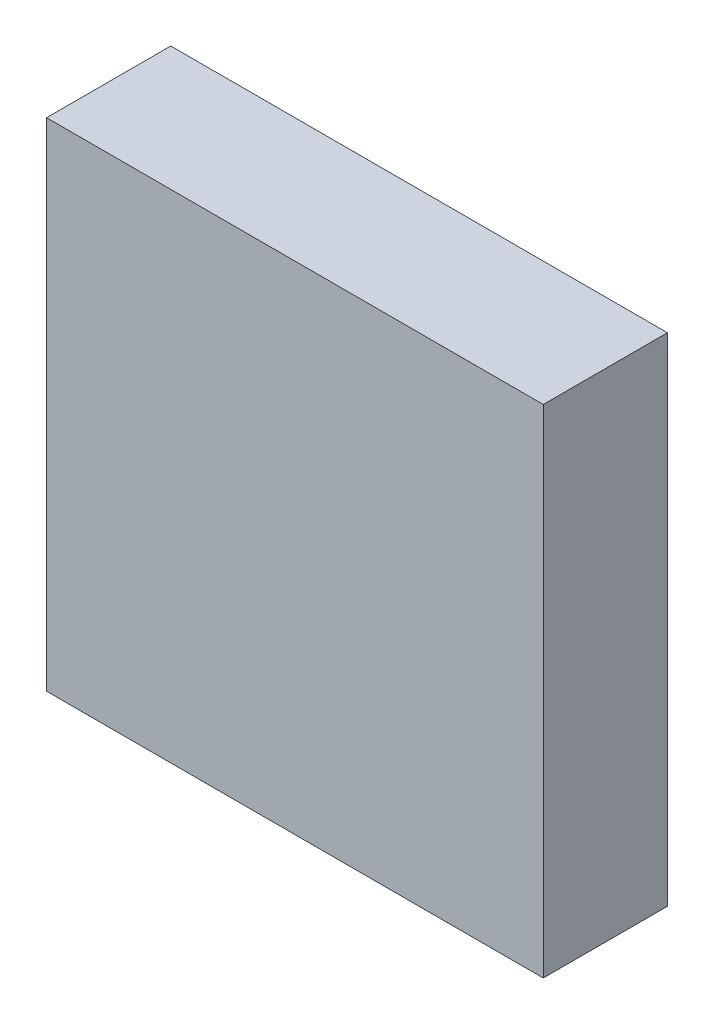
ISO-10303-21;
HEADER;
FILE_DESCRIPTION(('STEP AP214'),'2;1');
FILE_NAME('part.step','',(''),(''),'','','');
FILE_SCHEMA(('AUTOMOTIVE_DESIGN { 1 0 10303 214 1 1 1 1 }'));
ENDSEC;
DATA;
#1=APPLICATION_CONTEXT('core data for automotive mechanical design processes');
#2=APPLICATION_PROTOCOL_DEFINITION('international standard','automotive_design',2000,#1);
#3=PRODUCT_CONTEXT('',#1,'mechanical');
#4=PRODUCT('Part','Part','',(#3));
#5=PRODUCT_RELATED_PRODUCT_CATEGORY('part','',(#4));
#6=PRODUCT_DEFINITION_FORMATION('','',#4);
#7=PRODUCT_DEFINITION_CONTEXT('part definition',#1,'design');
#8=PRODUCT_DEFINITION('design','',#6,#7);
#9=PRODUCT_DEFINITION_SHAPE('','',#8);
#10=(LENGTH_UNIT() NAMED_UNIT(*) SI_UNIT(.MILLI.,.METRE.));
#11=(NAMED_UNIT(*) PLANE_ANGLE_UNIT() SI_UNIT($,.RADIAN.));
#12=(NAMED_UNIT(*) SI_UNIT($,.STERADIAN.) SOLID_ANGLE_UNIT());
#13=UNCERTAINTY_MEASURE_WITH_UNIT(LENGTH_MEASURE(1.E-05),#10,'distance_accuracy_value','');
#14=(GEOMETRIC_REPRESENTATION_CONTEXT(3) GLOBAL_UNCERTAINTY_ASSIGNED_CONTEXT((#13)) GLOBAL_UNIT_ASSIGNED_CONTEXT((#10,
#11,#12)) REPRESENTATION_CONTEXT('',''));
#15=CARTESIAN_POINT('',(0.,0.,0.));
#16=DIRECTION('',(0.,0.,1.));
#17=DIRECTION('',(1.,0.,0.));
#18=AXIS2_PLACEMENT_3D('',#15,#16,#17);
#19=CARTESIAN_POINT('',(-100.,100.,50.));
#20=DIRECTION('',(1.,0.,0.));
#21=DIRECTION('',(0.,0.,-1.));
#22=AXIS2_PLACEMENT_3D('',#19,#20,#21);
#23=PLANE('',#22);
#24=DIRECTION('',(0.,-1.,0.));
#25=VECTOR('',#24,1.);
#26=CARTESIAN_POINT('',(-100.,100.,0.));
#27=LINE('',#26,#25);
#28=CARTESIAN_POINT('',(-100.,100.,0.));
#29=VERTEX_POINT('',#28);
#30=CARTESIAN_POINT('',(-100.,-100.,0.));
#31=VERTEX_POINT('',#30);
#32=EDGE_CURVE('E394',#29,#31,#27,.T.);
#33=ORIENTED_EDGE('',*,*,#32,.T.);
#34=DIRECTION('',(0.,0.,-1.));
#35=VECTOR('',#34,1.);
#36=CARTESIAN_POINT('',(-100.,-100.,50.));
#37=LINE('',#36,#35);
#38=CARTESIAN_POINT('',(-100.,-100.,50.));
#39=VERTEX_POINT('',#38);
#40=EDGE_CURVE('E11',#39,#31,#37,.T.);
#41=ORIENTED_EDGE('',*,*,#40,.F.);
#42=DIRECTION('',(0.,-1.,0.));
#43=VECTOR('',#42,1.);
#44=CARTESIAN_POINT('',(-100.,100.,50.));
#45=LINE('',#44,#43);
#46=CARTESIAN_POINT('',(-100.,100.,50.));
#47=VERTEX_POINT('',#46);
#48=EDGE_CURVE('E412',#47,#39,#45,.T.);
#49=ORIENTED_EDGE('',*,*,#48,.F.);
#50=DIRECTION('',(0.,0.,-1.));
#51=VECTOR('',#50,1.);
#52=CARTESIAN_POINT('',(-100.,100.,50.));
#53=LINE('',#52,#51);
#54=EDGE_CURVE('E406',#47,#29,#53,.T.);
#55=ORIENTED_EDGE('',*,*,#54,.T.);
#56=EDGE_LOOP('',(#33,#41,#49,#55));
#57=FACE_BOUND('',#56,.T.);
#58=ADVANCED_FACE('F350',(#57),#23,.F.);
#59=CARTESIAN_POINT('',(-100.,-100.,50.));
#60=DIRECTION('',(0.,1.,0.));
#61=DIRECTION('',(0.,0.,1.));
#62=AXIS2_PLACEMENT_3D('',#59,#60,#61);
#63=PLANE('',#62);
#64=DIRECTION('',(1.,0.,0.));
#65=VECTOR('',#64,1.);
#66=CARTESIAN_POINT('',(-100.,-100.,0.));
#67=LINE('',#66,#65);
#68=CARTESIAN_POINT('',(100.,-100.,0.));
#69=VERTEX_POINT('',#68);
#70=EDGE_CURVE('E390',#31,#69,#67,.T.);
#71=ORIENTED_EDGE('',*,*,#70,.T.);
#72=DIRECTION('',(0.,0.,-1.));
#73=VECTOR('',#72,1.);
#74=CARTESIAN_POINT('',(100.,-100.,50.));
#75=LINE('',#74,#73);
#76=CARTESIAN_POINT('',(100.,-100.,50.));
#77=VERTEX_POINT('',#76);
#78=EDGE_CURVE('E357',#77,#69,#75,.T.);
#79=ORIENTED_EDGE('',*,*,#78,.F.);
#80=DIRECTION('',(1.,0.,0.));
#81=VECTOR('',#80,1.);
#82=CARTESIAN_POINT('',(-100.,-100.,50.));
#83=LINE('',#82,#81);
#84=EDGE_CURVE('E402',#39,#77,#83,.T.);
#85=ORIENTED_EDGE('',*,*,#84,.F.);
#86=ORIENTED_EDGE('',*,*,#40,.T.);
#87=EDGE_LOOP('',(#71,#79,#85,#86));
#88=FACE_BOUND('',#87,.T.);
#89=ADVANCED_FACE('F401',(#88),#63,.F.);
#90=CARTESIAN_POINT('',(100.,100.,50.));
#91=DIRECTION('',(-1.,0.,0.));
#92=DIRECTION('',(0.,0.,1.));
#93=AXIS2_PLACEMENT_3D('',#90,#91,#92);
#94=PLANE('',#93);
#95=DIRECTION('',(0.,1.,0.));
#96=VECTOR('',#95,1.);
#97=CARTESIAN_POINT('',(100.,100.,0.));
#98=LINE('',#97,#96);
#99=CARTESIAN_POINT('',(100.,100.,0.));
#100=VERTEX_POINT('',#99);
#101=EDGE_CURVE('E395',#69,#100,#98,.T.);
#102=ORIENTED_EDGE('',*,*,#101,.T.);
#103=DIRECTION('',(0.,0.,-1.));
#104=VECTOR('',#103,1.);
#105=CARTESIAN_POINT('',(100.,100.,50.));
#106=LINE('',#105,#104);
#107=CARTESIAN_POINT('',(100.,100.,50.));
#108=VERTEX_POINT('',#107);
#109=EDGE_CURVE('E418',#108,#100,#106,.T.);
#110=ORIENTED_EDGE('',*,*,#109,.F.);
#111=DIRECTION('',(0.,1.,0.));
#112=VECTOR('',#111,1.);
#113=CARTESIAN_POINT('',(100.,100.,50.));
#114=LINE('',#113,#112);
#115=EDGE_CURVE('E369',#77,#108,#114,.T.);
#116=ORIENTED_EDGE('',*,*,#115,.F.);
#117=ORIENTED_EDGE('',*,*,#78,.T.);
#118=EDGE_LOOP('',(#102,#110,#116,#117));
#119=FACE_BOUND('',#118,.T.);
#120=ADVANCED_FACE('F421',(#119),#94,.F.);
#121=CARTESIAN_POINT('',(-100.,100.,50.));
#122=DIRECTION('',(0.,-1.,0.));
#123=DIRECTION('',(0.,0.,-1.));
#124=AXIS2_PLACEMENT_3D('',#121,#122,#123);
#125=PLANE('',#124);
#126=DIRECTION('',(-1.,0.,0.));
#127=VECTOR('',#126,1.);
#128=CARTESIAN_POINT('',(-100.,100.,0.));
#129=LINE('',#128,#127);
#130=EDGE_CURVE('E410',#100,#29,#129,.T.);
#131=ORIENTED_EDGE('',*,*,#130,.T.);
#132=ORIENTED_EDGE('',*,*,#54,.F.);
#133=DIRECTION('',(-1.,0.,0.));
#134=VECTOR('',#133,1.);
#135=CARTESIAN_POINT('',(-100.,100.,50.));
#136=LINE('',#135,#134);
#137=EDGE_CURVE('E364',#108,#47,#136,.T.);
#138=ORIENTED_EDGE('',*,*,#137,.F.);
#139=ORIENTED_EDGE('',*,*,#109,.T.);
#140=EDGE_LOOP('',(#131,#132,#138,#139));
#141=FACE_BOUND('',#140,.T.);
#142=ADVANCED_FACE('F423',(#141),#125,.F.);
#143=CARTESIAN_POINT('',(-100.,-100.,50.));
#144=DIRECTION('',(0.,0.,1.));
#145=DIRECTION('',(1.,0.,0.));
#146=AXIS2_PLACEMENT_3D('',#143,#144,#145);
#147=PLANE('',#146);
#148=ORIENTED_EDGE('',*,*,#48,.T.);
#149=ORIENTED_EDGE('',*,*,#84,.T.);
#150=ORIENTED_EDGE('',*,*,#115,.T.);
#151=ORIENTED_EDGE('',*,*,#137,.T.);
#152=EDGE_LOOP('',(#148,#149,#150,#151));
#153=FACE_BOUND('',#152,.T.);
#154=ADVANCED_FACE('F424',(#153),#147,.T.);
#155=CARTESIAN_POINT('',(-100.,-100.,0.));
#156=DIRECTION('',(0.,0.,1.));
#157=DIRECTION('',(1.,0.,0.));
#158=AXIS2_PLACEMENT_3D('',#155,#156,#157);
#159=PLANE('',#158);
#160=ORIENTED_EDGE('',*,*,#32,.F.);
#161=ORIENTED_EDGE('',*,*,#130,.F.);
#162=ORIENTED_EDGE('',*,*,#101,.F.);
#163=ORIENTED_EDGE('',*,*,#70,.F.);
#164=EDGE_LOOP('',(#160,#161,#162,#163));
#165=FACE_BOUND('',#164,.T.);
#166=ADVANCED_FACE('F391',(#165),#159,.F.);
#167=CLOSED_SHELL('',(#58,#89,#120,#142,#154,#166));
#168=MANIFOLD_SOLID_BREP('B2',#167);
#169=ADVANCED_BREP_SHAPE_REPRESENTATION('',(#18,#168),#14);
#170=SHAPE_DEFINITION_REPRESENTATION(#9,#169);
ENDSEC;
END-ISO-10303-21;
